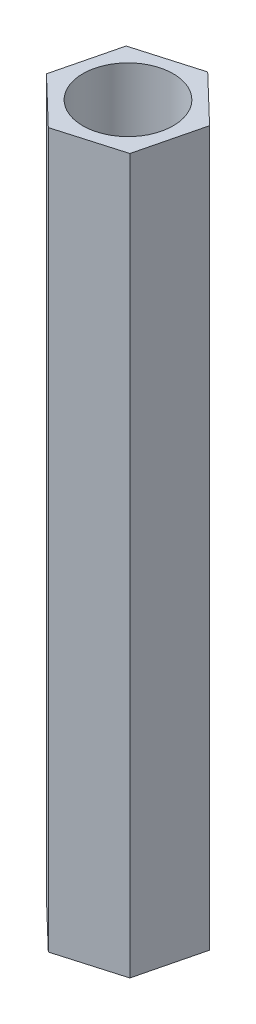
ISO-10303-21;
HEADER;
FILE_DESCRIPTION(('STEP AP214'),'2;1');
FILE_NAME('part.step','',(''),(''),'','','');
FILE_SCHEMA(('AUTOMOTIVE_DESIGN { 1 0 10303 214 1 1 1 1 }'));
ENDSEC;
DATA;
#1=APPLICATION_CONTEXT('core data for automotive mechanical design processes');
#2=APPLICATION_PROTOCOL_DEFINITION('international standard','automotive_design',2000,#1);
#3=PRODUCT_CONTEXT('',#1,'mechanical');
#4=PRODUCT('Part','Part','',(#3));
#5=PRODUCT_RELATED_PRODUCT_CATEGORY('part','',(#4));
#6=PRODUCT_DEFINITION_FORMATION('','',#4);
#7=PRODUCT_DEFINITION_CONTEXT('part definition',#1,'design');
#8=PRODUCT_DEFINITION('design','',#6,#7);
#9=PRODUCT_DEFINITION_SHAPE('','',#8);
#10=(LENGTH_UNIT() NAMED_UNIT(*) SI_UNIT(.MILLI.,.METRE.));
#11=(NAMED_UNIT(*) PLANE_ANGLE_UNIT() SI_UNIT($,.RADIAN.));
#12=(NAMED_UNIT(*) SI_UNIT($,.STERADIAN.) SOLID_ANGLE_UNIT());
#13=UNCERTAINTY_MEASURE_WITH_UNIT(LENGTH_MEASURE(1.E-05),#10,'distance_accuracy_value','');
#14=(GEOMETRIC_REPRESENTATION_CONTEXT(3) GLOBAL_UNCERTAINTY_ASSIGNED_CONTEXT((#13)) GLOBAL_UNIT_ASSIGNED_CONTEXT((#10,
#11,#12)) REPRESENTATION_CONTEXT('',''));
#15=CARTESIAN_POINT('',(0.,0.,0.));
#16=DIRECTION('',(0.,0.,1.));
#17=DIRECTION('',(1.,0.,0.));
#18=AXIS2_PLACEMENT_3D('',#15,#16,#17);
#19=CARTESIAN_POINT('',(1.37425219489352,20.66,1.31963286744092));
#20=DIRECTION('',(-0.970973902791824,0.,-0.239185451265778));
#21=DIRECTION('',(-0.239185451265778,0.,0.970973902791824));
#22=AXIS2_PLACEMENT_3D('',#19,#20,#21);
#23=PLANE('',#22);
#24=DIRECTION('',(0.239185451265778,0.,-0.970973902791824));
#25=VECTOR('',#24,1.);
#26=CARTESIAN_POINT('',(1.37425219489352,0.,1.31963286744092));
#27=LINE('',#26,#25);
#28=CARTESIAN_POINT('',(1.37425219489352,0.,1.31963286744092));
#29=VERTEX_POINT('',#28);
#30=CARTESIAN_POINT('',(1.8299616843195,0.,-0.530320878263851));
#31=VERTEX_POINT('',#30);
#32=EDGE_CURVE('E117',#29,#31,#27,.T.);
#33=ORIENTED_EDGE('',*,*,#32,.T.);
#34=DIRECTION('',(0.,-1.,0.));
#35=VECTOR('',#34,1.);
#36=CARTESIAN_POINT('',(1.8299616843195,20.66,-0.530320878263851));
#37=LINE('',#36,#35);
#38=CARTESIAN_POINT('',(1.8299616843195,20.66,-0.530320878263851));
#39=VERTEX_POINT('',#38);
#40=EDGE_CURVE('E11',#39,#31,#37,.T.);
#41=ORIENTED_EDGE('',*,*,#40,.F.);
#42=DIRECTION('',(0.239185451265778,0.,-0.970973902791824));
#43=VECTOR('',#42,1.);
#44=CARTESIAN_POINT('',(1.37425219489352,20.66,1.31963286744092));
#45=LINE('',#44,#43);
#46=CARTESIAN_POINT('',(1.37425219489352,20.66,1.31963286744092));
#47=VERTEX_POINT('',#46);
#48=EDGE_CURVE('E128',#47,#39,#45,.T.);
#49=ORIENTED_EDGE('',*,*,#48,.F.);
#50=DIRECTION('',(0.,-1.,0.));
#51=VECTOR('',#50,1.);
#52=CARTESIAN_POINT('',(1.37425219489352,20.66,1.31963286744092));
#53=LINE('',#52,#51);
#54=EDGE_CURVE('E113',#47,#29,#53,.T.);
#55=ORIENTED_EDGE('',*,*,#54,.T.);
#56=EDGE_LOOP('',(#33,#41,#49,#55));
#57=FACE_BOUND('',#56,.T.);
#58=ADVANCED_FACE('F33',(#57),#23,.F.);
#59=CARTESIAN_POINT('',(1.8299616843195,20.66,-0.530320878263851));
#60=DIRECTION('',(-0.692627628407721,0.,0.721295340596552));
#61=DIRECTION('',(0.721295340596552,0.,0.692627628407721));
#62=AXIS2_PLACEMENT_3D('',#59,#60,#61);
#63=PLANE('',#62);
#64=DIRECTION('',(-0.721295340596552,0.,-0.692627628407721));
#65=VECTOR('',#64,1.);
#66=CARTESIAN_POINT('',(1.8299616843195,0.,-0.530320878263851));
#67=LINE('',#66,#65);
#68=CARTESIAN_POINT('',(0.45570948942598,0.,-1.84995374570477));
#69=VERTEX_POINT('',#68);
#70=EDGE_CURVE('E120',#31,#69,#67,.T.);
#71=ORIENTED_EDGE('',*,*,#70,.T.);
#72=DIRECTION('',(0.,-1.,0.));
#73=VECTOR('',#72,1.);
#74=CARTESIAN_POINT('',(0.45570948942598,20.66,-1.84995374570477));
#75=LINE('',#74,#73);
#76=CARTESIAN_POINT('',(0.45570948942598,20.66,-1.84995374570477));
#77=VERTEX_POINT('',#76);
#78=EDGE_CURVE('E41',#77,#69,#75,.T.);
#79=ORIENTED_EDGE('',*,*,#78,.F.);
#80=DIRECTION('',(-0.721295340596552,0.,-0.692627628407721));
#81=VECTOR('',#80,1.);
#82=CARTESIAN_POINT('',(1.8299616843195,20.66,-0.530320878263851));
#83=LINE('',#82,#81);
#84=EDGE_CURVE('E86',#39,#77,#83,.T.);
#85=ORIENTED_EDGE('',*,*,#84,.F.);
#86=ORIENTED_EDGE('',*,*,#40,.T.);
#87=EDGE_LOOP('',(#71,#79,#85,#86));
#88=FACE_BOUND('',#87,.T.);
#89=ADVANCED_FACE('F153',(#88),#63,.F.);
#90=CARTESIAN_POINT('',(0.45570948942598,20.66,-1.84995374570477));
#91=DIRECTION('',(0.278346274384103,0.,0.960480791862331));
#92=DIRECTION('',(0.960480791862331,0.,-0.278346274384103));
#93=AXIS2_PLACEMENT_3D('',#90,#91,#92);
#94=PLANE('',#93);
#95=DIRECTION('',(-0.960480791862331,0.,0.278346274384103));
#96=VECTOR('',#95,1.);
#97=CARTESIAN_POINT('',(0.45570948942598,0.,-1.84995374570477));
#98=LINE('',#97,#96);
#99=CARTESIAN_POINT('',(-1.37425219489352,0.,-1.31963286744092));
#100=VERTEX_POINT('',#99);
#101=EDGE_CURVE('E123',#69,#100,#98,.T.);
#102=ORIENTED_EDGE('',*,*,#101,.T.);
#103=DIRECTION('',(0.,-1.,0.));
#104=VECTOR('',#103,1.);
#105=CARTESIAN_POINT('',(-1.37425219489352,20.66,-1.31963286744092));
#106=LINE('',#105,#104);
#107=CARTESIAN_POINT('',(-1.37425219489352,20.66,-1.31963286744092));
#108=VERTEX_POINT('',#107);
#109=EDGE_CURVE('E108',#108,#100,#106,.T.);
#110=ORIENTED_EDGE('',*,*,#109,.F.);
#111=DIRECTION('',(-0.960480791862331,0.,0.278346274384103));
#112=VECTOR('',#111,1.);
#113=CARTESIAN_POINT('',(0.45570948942598,20.66,-1.84995374570477));
#114=LINE('',#113,#112);
#115=EDGE_CURVE('E99',#77,#108,#114,.T.);
#116=ORIENTED_EDGE('',*,*,#115,.F.);
#117=ORIENTED_EDGE('',*,*,#78,.T.);
#118=EDGE_LOOP('',(#102,#110,#116,#117));
#119=FACE_BOUND('',#118,.T.);
#120=ADVANCED_FACE('F134',(#119),#94,.F.);
#121=CARTESIAN_POINT('',(-1.37425219489352,20.66,-1.31963286744092));
#122=DIRECTION('',(0.970973902791824,0.,0.239185451265778));
#123=DIRECTION('',(0.239185451265778,0.,-0.970973902791824));
#124=AXIS2_PLACEMENT_3D('',#121,#122,#123);
#125=PLANE('',#124);
#126=DIRECTION('',(-0.239185451265778,0.,0.970973902791824));
#127=VECTOR('',#126,1.);
#128=CARTESIAN_POINT('',(-1.37425219489352,0.,-1.31963286744092));
#129=LINE('',#128,#127);
#130=CARTESIAN_POINT('',(-1.8299616843195,0.,0.530320878263851));
#131=VERTEX_POINT('',#130);
#132=EDGE_CURVE('E107',#100,#131,#129,.T.);
#133=ORIENTED_EDGE('',*,*,#132,.T.);
#134=DIRECTION('',(0.,-1.,0.));
#135=VECTOR('',#134,1.);
#136=CARTESIAN_POINT('',(-1.8299616843195,20.66,0.530320878263851));
#137=LINE('',#136,#135);
#138=CARTESIAN_POINT('',(-1.8299616843195,20.66,0.530320878263851));
#139=VERTEX_POINT('',#138);
#140=EDGE_CURVE('E104',#139,#131,#137,.T.);
#141=ORIENTED_EDGE('',*,*,#140,.F.);
#142=DIRECTION('',(-0.239185451265778,0.,0.970973902791824));
#143=VECTOR('',#142,1.);
#144=CARTESIAN_POINT('',(-1.37425219489352,20.66,-1.31963286744092));
#145=LINE('',#144,#143);
#146=EDGE_CURVE('E93',#108,#139,#145,.T.);
#147=ORIENTED_EDGE('',*,*,#146,.F.);
#148=ORIENTED_EDGE('',*,*,#109,.T.);
#149=EDGE_LOOP('',(#133,#141,#147,#148));
#150=FACE_BOUND('',#149,.T.);
#151=ADVANCED_FACE('F105',(#150),#125,.F.);
#152=CARTESIAN_POINT('',(-1.8299616843195,20.66,0.530320878263851));
#153=DIRECTION('',(0.692627628407721,0.,-0.721295340596552));
#154=DIRECTION('',(-0.721295340596552,0.,-0.692627628407721));
#155=AXIS2_PLACEMENT_3D('',#152,#153,#154);
#156=PLANE('',#155);
#157=DIRECTION('',(0.721295340596552,0.,0.692627628407721));
#158=VECTOR('',#157,1.);
#159=CARTESIAN_POINT('',(-1.8299616843195,0.,0.530320878263851));
#160=LINE('',#159,#158);
#161=CARTESIAN_POINT('',(-0.455709489425981,0.,1.84995374570477));
#162=VERTEX_POINT('',#161);
#163=EDGE_CURVE('E72',#131,#162,#160,.T.);
#164=ORIENTED_EDGE('',*,*,#163,.T.);
#165=DIRECTION('',(0.,-1.,0.));
#166=VECTOR('',#165,1.);
#167=CARTESIAN_POINT('',(-0.455709489425981,20.66,1.84995374570477));
#168=LINE('',#167,#166);
#169=CARTESIAN_POINT('',(-0.455709489425981,20.66,1.84995374570477));
#170=VERTEX_POINT('',#169);
#171=EDGE_CURVE('E109',#170,#162,#168,.T.);
#172=ORIENTED_EDGE('',*,*,#171,.F.);
#173=DIRECTION('',(0.721295340596552,0.,0.692627628407721));
#174=VECTOR('',#173,1.);
#175=CARTESIAN_POINT('',(-1.8299616843195,20.66,0.530320878263851));
#176=LINE('',#175,#174);
#177=EDGE_CURVE('E97',#139,#170,#176,.T.);
#178=ORIENTED_EDGE('',*,*,#177,.F.);
#179=ORIENTED_EDGE('',*,*,#140,.T.);
#180=EDGE_LOOP('',(#164,#172,#178,#179));
#181=FACE_BOUND('',#180,.T.);
#182=ADVANCED_FACE('F111',(#181),#156,.F.);
#183=CARTESIAN_POINT('',(-0.455709489425981,20.66,1.84995374570477));
#184=DIRECTION('',(-0.278346274384103,0.,-0.960480791862331));
#185=DIRECTION('',(-0.960480791862331,0.,0.278346274384103));
#186=AXIS2_PLACEMENT_3D('',#183,#184,#185);
#187=PLANE('',#186);
#188=DIRECTION('',(0.960480791862331,0.,-0.278346274384103));
#189=VECTOR('',#188,1.);
#190=CARTESIAN_POINT('',(-0.455709489425981,0.,1.84995374570477));
#191=LINE('',#190,#189);
#192=EDGE_CURVE('E78',#162,#29,#191,.T.);
#193=ORIENTED_EDGE('',*,*,#192,.T.);
#194=ORIENTED_EDGE('',*,*,#54,.F.);
#195=DIRECTION('',(0.960480791862331,0.,-0.278346274384103));
#196=VECTOR('',#195,1.);
#197=CARTESIAN_POINT('',(-0.455709489425981,20.66,1.84995374570477));
#198=LINE('',#197,#196);
#199=EDGE_CURVE('E49',#170,#47,#198,.T.);
#200=ORIENTED_EDGE('',*,*,#199,.F.);
#201=ORIENTED_EDGE('',*,*,#171,.T.);
#202=EDGE_LOOP('',(#193,#194,#200,#201));
#203=FACE_BOUND('',#202,.T.);
#204=ADVANCED_FACE('F141',(#203),#187,.F.);
#205=CARTESIAN_POINT('',(0.,20.66,0.));
#206=DIRECTION('',(0.,1.,0.));
#207=DIRECTION('',(0.,0.,1.));
#208=AXIS2_PLACEMENT_3D('',#205,#206,#207);
#209=PLANE('',#208);
#210=CARTESIAN_POINT('',(0.,20.66,0.));
#211=DIRECTION('',(0.,1.,0.));
#212=DIRECTION('',(0.,0.,1.));
#213=AXIS2_PLACEMENT_3D('',#210,#211,#212);
#214=CIRCLE('',#213,1.30781053718465);
#215=CARTESIAN_POINT('',(0.,20.66,1.30781053718465));
#216=VERTEX_POINT('',#215);
#217=EDGE_CURVE('E208',#216,#216,#214,.T.);
#218=ORIENTED_EDGE('',*,*,#217,.F.);
#219=EDGE_LOOP('',(#218));
#220=FACE_BOUND('',#219,.T.);
#221=ORIENTED_EDGE('',*,*,#48,.T.);
#222=ORIENTED_EDGE('',*,*,#84,.T.);
#223=ORIENTED_EDGE('',*,*,#115,.T.);
#224=ORIENTED_EDGE('',*,*,#146,.T.);
#225=ORIENTED_EDGE('',*,*,#177,.T.);
#226=ORIENTED_EDGE('',*,*,#199,.T.);
#227=EDGE_LOOP('',(#221,#222,#223,#224,#225,#226));
#228=FACE_BOUND('',#227,.T.);
#229=ADVANCED_FACE('F95',(#220,#228),#209,.T.);
#230=CARTESIAN_POINT('',(0.,0.,0.));
#231=DIRECTION('',(0.,1.,0.));
#232=DIRECTION('',(0.,0.,1.));
#233=AXIS2_PLACEMENT_3D('',#230,#231,#232);
#234=PLANE('',#233);
#235=CARTESIAN_POINT('',(0.,0.,0.));
#236=DIRECTION('',(0.,1.,0.));
#237=DIRECTION('',(0.,0.,1.));
#238=AXIS2_PLACEMENT_3D('',#235,#236,#237);
#239=CIRCLE('',#238,1.30781053718465);
#240=CARTESIAN_POINT('',(0.,0.,1.30781053718465));
#241=VERTEX_POINT('',#240);
#242=EDGE_CURVE('E121',#241,#241,#239,.T.);
#243=ORIENTED_EDGE('',*,*,#242,.T.);
#244=EDGE_LOOP('',(#243));
#245=FACE_BOUND('',#244,.T.);
#246=ORIENTED_EDGE('',*,*,#32,.F.);
#247=ORIENTED_EDGE('',*,*,#192,.F.);
#248=ORIENTED_EDGE('',*,*,#163,.F.);
#249=ORIENTED_EDGE('',*,*,#132,.F.);
#250=ORIENTED_EDGE('',*,*,#101,.F.);
#251=ORIENTED_EDGE('',*,*,#70,.F.);
#252=EDGE_LOOP('',(#246,#247,#248,#249,#250,#251));
#253=FACE_BOUND('',#252,.T.);
#254=ADVANCED_FACE('F137',(#245,#253),#234,.F.);
#255=CARTESIAN_POINT('',(0.,0.,0.));
#256=DIRECTION('',(0.,1.,0.));
#257=DIRECTION('',(0.,0.,1.));
#258=AXIS2_PLACEMENT_3D('',#255,#256,#257);
#259=CYLINDRICAL_SURFACE('',#258,1.30781053718465);
#260=ORIENTED_EDGE('',*,*,#242,.F.);
#261=EDGE_LOOP('',(#260));
#262=FACE_BOUND('',#261,.T.);
#263=ORIENTED_EDGE('',*,*,#217,.T.);
#264=EDGE_LOOP('',(#263));
#265=FACE_BOUND('',#264,.T.);
#266=ADVANCED_FACE('F190',(#262,#265),#259,.F.);
#267=CLOSED_SHELL('',(#58,#89,#120,#151,#182,#204,#229,#254,#266));
#268=MANIFOLD_SOLID_BREP('B2',#267);
#269=ADVANCED_BREP_SHAPE_REPRESENTATION('',(#18,#268),#14);
#270=SHAPE_DEFINITION_REPRESENTATION(#9,#269);
ENDSEC;
END-ISO-10303-21;
